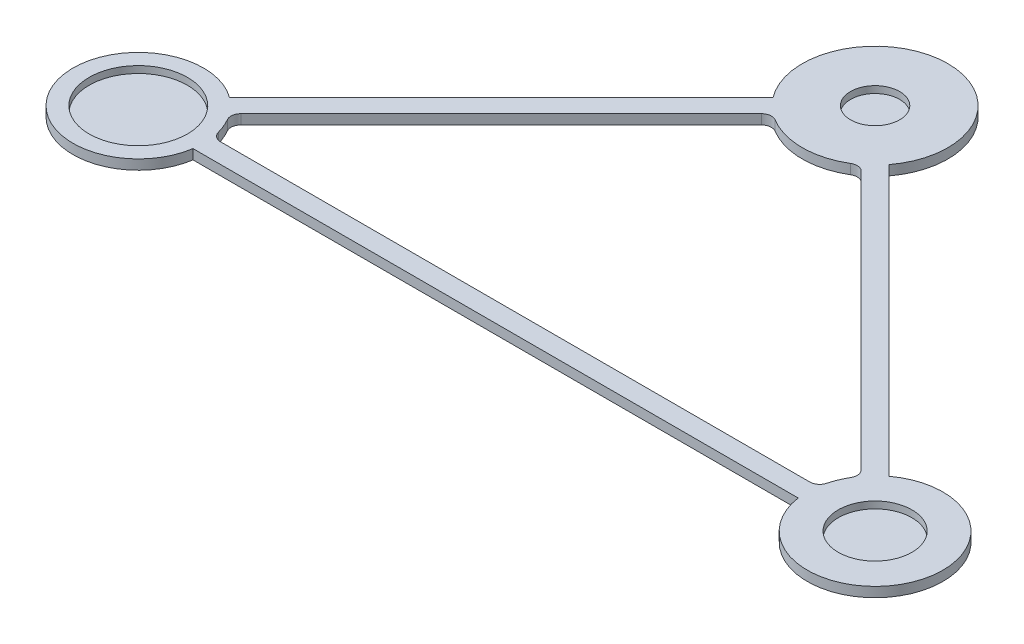
ISO-10303-21;
HEADER;
FILE_DESCRIPTION(('STEP AP214'),'2;1');
FILE_NAME('part.step','',(''),(''),'','','');
FILE_SCHEMA(('AUTOMOTIVE_DESIGN { 1 0 10303 214 1 1 1 1 }'));
ENDSEC;
DATA;
#1=APPLICATION_CONTEXT('core data for automotive mechanical design processes');
#2=APPLICATION_PROTOCOL_DEFINITION('international standard','automotive_design',2000,#1);
#3=PRODUCT_CONTEXT('',#1,'mechanical');
#4=PRODUCT('Part','Part','',(#3));
#5=PRODUCT_RELATED_PRODUCT_CATEGORY('part','',(#4));
#6=PRODUCT_DEFINITION_FORMATION('','',#4);
#7=PRODUCT_DEFINITION_CONTEXT('part definition',#1,'design');
#8=PRODUCT_DEFINITION('design','',#6,#7);
#9=PRODUCT_DEFINITION_SHAPE('','',#8);
#10=(LENGTH_UNIT() NAMED_UNIT(*) SI_UNIT(.MILLI.,.METRE.));
#11=(NAMED_UNIT(*) PLANE_ANGLE_UNIT() SI_UNIT($,.RADIAN.));
#12=(NAMED_UNIT(*) SI_UNIT($,.STERADIAN.) SOLID_ANGLE_UNIT());
#13=UNCERTAINTY_MEASURE_WITH_UNIT(LENGTH_MEASURE(1.E-05),#10,'distance_accuracy_value','');
#14=(GEOMETRIC_REPRESENTATION_CONTEXT(3) GLOBAL_UNCERTAINTY_ASSIGNED_CONTEXT((#13)) GLOBAL_UNIT_ASSIGNED_CONTEXT((#10,
#11,#12)) REPRESENTATION_CONTEXT('',''));
#15=CARTESIAN_POINT('',(0.,0.,0.));
#16=DIRECTION('',(0.,0.,1.));
#17=DIRECTION('',(1.,0.,0.));
#18=AXIS2_PLACEMENT_3D('',#15,#16,#17);
#19=CARTESIAN_POINT('',(-75.,2.,0.));
#20=DIRECTION('',(0.,1.,0.));
#21=DIRECTION('',(0.,0.,1.));
#22=AXIS2_PLACEMENT_3D('',#19,#20,#21);
#23=PLANE('',#22);
#24=CARTESIAN_POINT('',(0.,2.,-74.9999999999997));
#25=DIRECTION('',(0.,1.,0.));
#26=DIRECTION('',(0.,0.,1.));
#27=AXIS2_PLACEMENT_3D('',#24,#25,#26);
#28=CIRCLE('',#27,5.);
#29=CARTESIAN_POINT('',(0.,2.,-69.9999999999997));
#30=VERTEX_POINT('',#29);
#31=EDGE_CURVE('E651',#30,#30,#28,.T.);
#32=ORIENTED_EDGE('',*,*,#31,.F.);
#33=EDGE_LOOP('',(#32));
#34=FACE_BOUND('',#33,.T.);
#35=CARTESIAN_POINT('',(-75.,2.,0.));
#36=DIRECTION('',(0.,1.,0.));
#37=DIRECTION('',(0.,0.,1.));
#38=AXIS2_PLACEMENT_3D('',#35,#36,#37);
#39=CIRCLE('',#38,9.99999999999999);
#40=CARTESIAN_POINT('',(-75.,2.,9.99999999999999));
#41=VERTEX_POINT('',#40);
#42=EDGE_CURVE('E642',#41,#41,#39,.T.);
#43=ORIENTED_EDGE('',*,*,#42,.F.);
#44=EDGE_LOOP('',(#43));
#45=FACE_BOUND('',#44,.T.);
#46=CARTESIAN_POINT('',(75.,2.,0.));
#47=DIRECTION('',(0.,1.,0.));
#48=DIRECTION('',(0.,0.,1.));
#49=AXIS2_PLACEMENT_3D('',#46,#47,#48);
#50=CIRCLE('',#49,7.5);
#51=CARTESIAN_POINT('',(75.,2.,7.5));
#52=VERTEX_POINT('',#51);
#53=EDGE_CURVE('E643',#52,#52,#50,.T.);
#54=ORIENTED_EDGE('',*,*,#53,.F.);
#55=EDGE_LOOP('',(#54));
#56=FACE_BOUND('',#55,.T.);
#57=CARTESIAN_POINT('',(-75.,2.,0.));
#58=DIRECTION('',(0.,1.,0.));
#59=DIRECTION('',(0.,0.,1.));
#60=AXIS2_PLACEMENT_3D('',#57,#58,#59);
#61=CIRCLE('',#60,13.2892718791999);
#62=CARTESIAN_POINT('',(-67.1243064832011,2.,-10.7041206415448));
#63=VERTEX_POINT('',#62);
#64=CARTESIAN_POINT('',(-61.8620874154494,2.,2.));
#65=VERTEX_POINT('',#64);
#66=EDGE_CURVE('E179',#63,#65,#61,.T.);
#67=ORIENTED_EDGE('',*,*,#66,.T.);
#68=DIRECTION('',(1.,0.,0.));
#69=VECTOR('',#68,1.);
#70=CARTESIAN_POINT('',(-61.8620874154494,2.,2.));
#71=LINE('',#70,#69);
#72=CARTESIAN_POINT('',(61.3402793696848,2.,2.));
#73=VERTEX_POINT('',#72);
#74=EDGE_CURVE('E167',#65,#73,#71,.T.);
#75=ORIENTED_EDGE('',*,*,#74,.T.);
#76=CARTESIAN_POINT('',(75.,2.,0.));
#77=DIRECTION('',(0.,1.,0.));
#78=DIRECTION('',(0.,0.,1.));
#79=AXIS2_PLACEMENT_3D('',#76,#77,#78);
#80=CIRCLE('',#79,13.8053601075184);
#81=CARTESIAN_POINT('',(66.7553324755633,2.,-11.0730946491827));
#82=VERTEX_POINT('',#81);
#83=EDGE_CURVE('E178',#73,#82,#80,.T.);
#84=ORIENTED_EDGE('',*,*,#83,.T.);
#85=DIRECTION('',(-0.707106781186547,0.,-0.707106781186548));
#86=VECTOR('',#85,1.);
#87=CARTESIAN_POINT('',(11.803204492,2.,-66.0252226327459));
#88=LINE('',#87,#86);
#89=CARTESIAN_POINT('',(11.803204492,2.,-66.0252226327459));
#90=VERTEX_POINT('',#89);
#91=EDGE_CURVE('E324',#82,#90,#88,.T.);
#92=ORIENTED_EDGE('',*,*,#91,.T.);
#93=CARTESIAN_POINT('',(0.,2.,-74.9999999999997));
#94=DIRECTION('',(0.,1.,0.));
#95=DIRECTION('',(0.,0.,1.));
#96=AXIS2_PLACEMENT_3D('',#93,#94,#95);
#97=CIRCLE('',#96,14.8277532037643);
#98=CARTESIAN_POINT('',(-11.803204492,2.,-66.0252226327459));
#99=VERTEX_POINT('',#98);
#100=EDGE_CURVE('E327',#90,#99,#97,.T.);
#101=ORIENTED_EDGE('',*,*,#100,.T.);
#102=DIRECTION('',(-0.707106781186547,0.,0.707106781186548));
#103=VECTOR('',#102,1.);
#104=CARTESIAN_POINT('',(-11.803204492,2.,-66.0252226327459));
#105=LINE('',#104,#103);
#106=EDGE_CURVE('E183',#99,#63,#105,.T.);
#107=ORIENTED_EDGE('',*,*,#106,.T.);
#108=EDGE_LOOP('',(#67,#75,#84,#92,#101,#107));
#109=FACE_BOUND('',#108,.T.);
#110=DIRECTION('',(1.,0.,0.));
#111=VECTOR('',#110,1.);
#112=CARTESIAN_POINT('',(-61.8620874154494,2.,-2.));
#113=LINE('',#112,#111);
#114=CARTESIAN_POINT('',(-60.2432444420837,2.,-2.));
#115=VERTEX_POINT('',#114);
#116=CARTESIAN_POINT('',(59.7091724184617,2.,-2.));
#117=VERTEX_POINT('',#116);
#118=EDGE_CURVE('E630',#115,#117,#113,.T.);
#119=ORIENTED_EDGE('',*,*,#118,.F.);
#120=CARTESIAN_POINT('',(-60.2432444420837,2.,-4.));
#121=DIRECTION('',(0.,1.,0.));
#122=DIRECTION('',(0.,0.,1.));
#123=AXIS2_PLACEMENT_3D('',#120,#121,#122);
#124=CIRCLE('',#123,2.);
#125=CARTESIAN_POINT('',(-62.1735856217696,2.,-3.47675729340104));
#126=VERTEX_POINT('',#125);
#127=EDGE_CURVE('E256',#115,#126,#124,.F.);
#128=ORIENTED_EDGE('',*,*,#127,.T.);
#129=CARTESIAN_POINT('',(-75.,2.,0.));
#130=DIRECTION('',(0.,-1.,0.));
#131=DIRECTION('',(0.,0.,1.));
#132=AXIS2_PLACEMENT_3D('',#129,#130,#131);
#133=CIRCLE('',#132,13.2892718791999);
#134=CARTESIAN_POINT('',(-63.4719167561409,2.,-6.61120592645158));
#135=VERTEX_POINT('',#134);
#136=EDGE_CURVE('E286',#135,#126,#133,.T.);
#137=ORIENTED_EDGE('',*,*,#136,.F.);
#138=CARTESIAN_POINT('',(-61.7369709519388,2.,-7.60617479856854));
#139=DIRECTION('',(0.,1.,0.));
#140=DIRECTION('',(0.,0.,1.));
#141=AXIS2_PLACEMENT_3D('',#138,#139,#140);
#142=CIRCLE('',#141,2.);
#143=CARTESIAN_POINT('',(-63.1511845143119,2.,-9.02038836094164));
#144=VERTEX_POINT('',#143);
#145=EDGE_CURVE('E262',#135,#144,#142,.F.);
#146=ORIENTED_EDGE('',*,*,#145,.T.);
#147=DIRECTION('',(-0.707106781186547,0.,0.707106781186548));
#148=VECTOR('',#147,1.);
#149=CARTESIAN_POINT('',(-8.97477736725386,2.,-63.1967955079997));
#150=LINE('',#149,#148);
#151=CARTESIAN_POINT('',(-10.1437550715781,2.,-62.0278178036755));
#152=VERTEX_POINT('',#151);
#153=EDGE_CURVE('E292',#152,#144,#150,.T.);
#154=ORIENTED_EDGE('',*,*,#153,.F.);
#155=CARTESIAN_POINT('',(-8.72954150920501,2.,-60.6136042413024));
#156=DIRECTION('',(0.,1.,0.));
#157=DIRECTION('',(0.,0.,1.));
#158=AXIS2_PLACEMENT_3D('',#155,#156,#157);
#159=CIRCLE('',#158,2.);
#160=CARTESIAN_POINT('',(-7.69202433106476,2.,-62.323445785149));
#161=VERTEX_POINT('',#160);
#162=EDGE_CURVE('E12',#152,#161,#159,.F.);
#163=ORIENTED_EDGE('',*,*,#162,.T.);
#164=CARTESIAN_POINT('',(0.,2.,-74.9999999999997));
#165=DIRECTION('',(0.,-1.,0.));
#166=DIRECTION('',(0.,0.,1.));
#167=AXIS2_PLACEMENT_3D('',#164,#165,#166);
#168=CIRCLE('',#167,14.8277532037643);
#169=CARTESIAN_POINT('',(7.69202433106477,2.,-62.323445785149));
#170=VERTEX_POINT('',#169);
#171=EDGE_CURVE('E289',#170,#161,#168,.T.);
#172=ORIENTED_EDGE('',*,*,#171,.F.);
#173=CARTESIAN_POINT('',(8.72954150920501,2.,-60.6136042413024));
#174=DIRECTION('',(0.,1.,0.));
#175=DIRECTION('',(0.,0.,1.));
#176=AXIS2_PLACEMENT_3D('',#173,#174,#175);
#177=CIRCLE('',#176,2.);
#178=CARTESIAN_POINT('',(10.1437550715781,2.,-62.0278178036755));
#179=VERTEX_POINT('',#178);
#180=EDGE_CURVE('E268',#170,#179,#177,.F.);
#181=ORIENTED_EDGE('',*,*,#180,.T.);
#182=DIRECTION('',(-0.707106781186548,0.,-0.707106781186548));
#183=VECTOR('',#182,1.);
#184=CARTESIAN_POINT('',(8.97477736725386,2.,-63.1967955079997));
#185=LINE('',#184,#183);
#186=CARTESIAN_POINT('',(62.7735385647668,2.,-9.3980343104868));
#187=VERTEX_POINT('',#186);
#188=EDGE_CURVE('E293',#187,#179,#185,.T.);
#189=ORIENTED_EDGE('',*,*,#188,.F.);
#190=CARTESIAN_POINT('',(61.3593250023937,2.,-7.9838207481137));
#191=DIRECTION('',(0.,1.,0.));
#192=DIRECTION('',(0.,0.,1.));
#193=AXIS2_PLACEMENT_3D('',#190,#191,#192);
#194=CIRCLE('',#193,2.);
#195=CARTESIAN_POINT('',(63.0854071548804,2.,-6.97355325736341));
#196=VERTEX_POINT('',#195);
#197=EDGE_CURVE('E244',#187,#196,#194,.F.);
#198=ORIENTED_EDGE('',*,*,#197,.T.);
#199=CARTESIAN_POINT('',(75.,2.,0.));
#200=DIRECTION('',(0.,-1.,0.));
#201=DIRECTION('',(0.,0.,1.));
#202=AXIS2_PLACEMENT_3D('',#199,#200,#201);
#203=CIRCLE('',#202,13.8053601075184);
#204=CARTESIAN_POINT('',(61.6440638068919,2.,-3.49384259861346));
#205=VERTEX_POINT('',#204);
#206=EDGE_CURVE('E299',#205,#196,#203,.T.);
#207=ORIENTED_EDGE('',*,*,#206,.F.);
#208=CARTESIAN_POINT('',(59.7091724184617,2.,-4.));
#209=DIRECTION('',(0.,1.,0.));
#210=DIRECTION('',(0.,0.,1.));
#211=AXIS2_PLACEMENT_3D('',#208,#209,#210);
#212=CIRCLE('',#211,2.);
#213=EDGE_CURVE('E250',#205,#117,#212,.F.);
#214=ORIENTED_EDGE('',*,*,#213,.T.);
#215=EDGE_LOOP('',(#119,#128,#137,#146,#154,#163,#172,#181,#189,#198,#207,#214));
#216=FACE_BOUND('',#215,.T.);
#217=ADVANCED_FACE('F41',(#34,#45,#56,#109,#216),#23,.T.);
#218=CARTESIAN_POINT('',(-75.,0.,0.));
#219=DIRECTION('',(0.,1.,0.));
#220=DIRECTION('',(0.,0.,1.));
#221=AXIS2_PLACEMENT_3D('',#218,#219,#220);
#222=PLANE('',#221);
#223=CARTESIAN_POINT('',(-75.,0.,0.));
#224=DIRECTION('',(0.,1.,0.));
#225=DIRECTION('',(0.,0.,1.));
#226=AXIS2_PLACEMENT_3D('',#223,#224,#225);
#227=CIRCLE('',#226,13.2892718791999);
#228=CARTESIAN_POINT('',(-67.1243064832011,0.,-10.7041206415448));
#229=VERTEX_POINT('',#228);
#230=CARTESIAN_POINT('',(-61.8620874154494,0.,2.));
#231=VERTEX_POINT('',#230);
#232=EDGE_CURVE('E192',#229,#231,#227,.T.);
#233=ORIENTED_EDGE('',*,*,#232,.F.);
#234=DIRECTION('',(-0.707106781186547,0.,0.707106781186548));
#235=VECTOR('',#234,1.);
#236=CARTESIAN_POINT('',(-11.803204492,0.,-66.0252226327459));
#237=LINE('',#236,#235);
#238=CARTESIAN_POINT('',(-11.803204492,0.,-66.0252226327459));
#239=VERTEX_POINT('',#238);
#240=EDGE_CURVE('E188',#239,#229,#237,.T.);
#241=ORIENTED_EDGE('',*,*,#240,.F.);
#242=CARTESIAN_POINT('',(0.,0.,-74.9999999999997));
#243=DIRECTION('',(0.,1.,0.));
#244=DIRECTION('',(0.,0.,1.));
#245=AXIS2_PLACEMENT_3D('',#242,#243,#244);
#246=CIRCLE('',#245,14.8277532037643);
#247=CARTESIAN_POINT('',(11.803204492,0.,-66.0252226327459));
#248=VERTEX_POINT('',#247);
#249=EDGE_CURVE('E344',#248,#239,#246,.T.);
#250=ORIENTED_EDGE('',*,*,#249,.F.);
#251=DIRECTION('',(-0.707106781186547,0.,-0.707106781186548));
#252=VECTOR('',#251,1.);
#253=CARTESIAN_POINT('',(11.803204492,0.,-66.0252226327459));
#254=LINE('',#253,#252);
#255=CARTESIAN_POINT('',(66.7553324755633,0.,-11.0730946491827));
#256=VERTEX_POINT('',#255);
#257=EDGE_CURVE('E341',#256,#248,#254,.T.);
#258=ORIENTED_EDGE('',*,*,#257,.F.);
#259=CARTESIAN_POINT('',(75.,0.,0.));
#260=DIRECTION('',(0.,1.,0.));
#261=DIRECTION('',(0.,0.,1.));
#262=AXIS2_PLACEMENT_3D('',#259,#260,#261);
#263=CIRCLE('',#262,13.8053601075184);
#264=CARTESIAN_POINT('',(61.3402793696848,0.,2.));
#265=VERTEX_POINT('',#264);
#266=EDGE_CURVE('E338',#265,#256,#263,.T.);
#267=ORIENTED_EDGE('',*,*,#266,.F.);
#268=DIRECTION('',(1.,0.,0.));
#269=VECTOR('',#268,1.);
#270=CARTESIAN_POINT('',(-61.8620874154494,0.,2.));
#271=LINE('',#270,#269);
#272=EDGE_CURVE('E335',#231,#265,#271,.T.);
#273=ORIENTED_EDGE('',*,*,#272,.F.);
#274=EDGE_LOOP('',(#233,#241,#250,#258,#267,#273));
#275=FACE_BOUND('',#274,.T.);
#276=DIRECTION('',(-0.707106781186547,0.,0.707106781186548));
#277=VECTOR('',#276,1.);
#278=CARTESIAN_POINT('',(-8.97477736725386,0.,-63.1967955079997));
#279=LINE('',#278,#277);
#280=CARTESIAN_POINT('',(-10.1437550715781,0.,-62.0278178036755));
#281=VERTEX_POINT('',#280);
#282=CARTESIAN_POINT('',(-63.1511845143119,0.,-9.02038836094164));
#283=VERTEX_POINT('',#282);
#284=EDGE_CURVE('E276',#281,#283,#279,.T.);
#285=ORIENTED_EDGE('',*,*,#284,.T.);
#286=CARTESIAN_POINT('',(-61.7369709519388,0.,-7.60617479856854));
#287=DIRECTION('',(0.,1.,0.));
#288=DIRECTION('',(0.,0.,1.));
#289=AXIS2_PLACEMENT_3D('',#286,#287,#288);
#290=CIRCLE('',#289,2.);
#291=CARTESIAN_POINT('',(-63.4719167561409,0.,-6.61120592645158));
#292=VERTEX_POINT('',#291);
#293=EDGE_CURVE('E259',#283,#292,#290,.T.);
#294=ORIENTED_EDGE('',*,*,#293,.T.);
#295=CARTESIAN_POINT('',(-75.,0.,0.));
#296=DIRECTION('',(0.,-1.,0.));
#297=DIRECTION('',(0.,0.,1.));
#298=AXIS2_PLACEMENT_3D('',#295,#296,#297);
#299=CIRCLE('',#298,13.2892718791999);
#300=CARTESIAN_POINT('',(-62.1735856217696,0.,-3.47675729340104));
#301=VERTEX_POINT('',#300);
#302=EDGE_CURVE('E303',#292,#301,#299,.T.);
#303=ORIENTED_EDGE('',*,*,#302,.T.);
#304=CARTESIAN_POINT('',(-60.2432444420837,0.,-4.));
#305=DIRECTION('',(0.,1.,0.));
#306=DIRECTION('',(0.,0.,1.));
#307=AXIS2_PLACEMENT_3D('',#304,#305,#306);
#308=CIRCLE('',#307,2.);
#309=CARTESIAN_POINT('',(-60.2432444420837,0.,-2.));
#310=VERTEX_POINT('',#309);
#311=EDGE_CURVE('E253',#301,#310,#308,.T.);
#312=ORIENTED_EDGE('',*,*,#311,.T.);
#313=DIRECTION('',(1.,0.,0.));
#314=VECTOR('',#313,1.);
#315=CARTESIAN_POINT('',(-61.8620874154494,0.,-2.));
#316=LINE('',#315,#314);
#317=CARTESIAN_POINT('',(59.7091724184617,0.,-2.));
#318=VERTEX_POINT('',#317);
#319=EDGE_CURVE('E307',#310,#318,#316,.T.);
#320=ORIENTED_EDGE('',*,*,#319,.T.);
#321=CARTESIAN_POINT('',(59.7091724184617,0.,-4.));
#322=DIRECTION('',(0.,1.,0.));
#323=DIRECTION('',(0.,0.,1.));
#324=AXIS2_PLACEMENT_3D('',#321,#322,#323);
#325=CIRCLE('',#324,2.);
#326=CARTESIAN_POINT('',(61.6440638068919,0.,-3.49384259861346));
#327=VERTEX_POINT('',#326);
#328=EDGE_CURVE('E247',#318,#327,#325,.T.);
#329=ORIENTED_EDGE('',*,*,#328,.T.);
#330=CARTESIAN_POINT('',(75.,0.,0.));
#331=DIRECTION('',(0.,-1.,0.));
#332=DIRECTION('',(0.,0.,1.));
#333=AXIS2_PLACEMENT_3D('',#330,#331,#332);
#334=CIRCLE('',#333,13.8053601075184);
#335=CARTESIAN_POINT('',(63.0854071548804,0.,-6.97355325736341));
#336=VERTEX_POINT('',#335);
#337=EDGE_CURVE('E312',#327,#336,#334,.T.);
#338=ORIENTED_EDGE('',*,*,#337,.T.);
#339=CARTESIAN_POINT('',(61.3593250023937,0.,-7.9838207481137));
#340=DIRECTION('',(0.,1.,0.));
#341=DIRECTION('',(0.,0.,1.));
#342=AXIS2_PLACEMENT_3D('',#339,#340,#341);
#343=CIRCLE('',#342,2.);
#344=CARTESIAN_POINT('',(62.7735385647668,0.,-9.3980343104868));
#345=VERTEX_POINT('',#344);
#346=EDGE_CURVE('E241',#336,#345,#343,.T.);
#347=ORIENTED_EDGE('',*,*,#346,.T.);
#348=DIRECTION('',(-0.707106781186548,0.,-0.707106781186548));
#349=VECTOR('',#348,1.);
#350=CARTESIAN_POINT('',(8.97477736725386,0.,-63.1967955079997));
#351=LINE('',#350,#349);
#352=CARTESIAN_POINT('',(10.1437550715781,0.,-62.0278178036755));
#353=VERTEX_POINT('',#352);
#354=EDGE_CURVE('E316',#345,#353,#351,.T.);
#355=ORIENTED_EDGE('',*,*,#354,.T.);
#356=CARTESIAN_POINT('',(8.72954150920501,0.,-60.6136042413024));
#357=DIRECTION('',(0.,1.,0.));
#358=DIRECTION('',(0.,0.,1.));
#359=AXIS2_PLACEMENT_3D('',#356,#357,#358);
#360=CIRCLE('',#359,2.);
#361=CARTESIAN_POINT('',(7.69202433106477,0.,-62.323445785149));
#362=VERTEX_POINT('',#361);
#363=EDGE_CURVE('E265',#353,#362,#360,.T.);
#364=ORIENTED_EDGE('',*,*,#363,.T.);
#365=CARTESIAN_POINT('',(0.,0.,-74.9999999999997));
#366=DIRECTION('',(0.,-1.,0.));
#367=DIRECTION('',(0.,0.,1.));
#368=AXIS2_PLACEMENT_3D('',#365,#366,#367);
#369=CIRCLE('',#368,14.8277532037643);
#370=CARTESIAN_POINT('',(-7.69202433106476,0.,-62.323445785149));
#371=VERTEX_POINT('',#370);
#372=EDGE_CURVE('E277',#362,#371,#369,.T.);
#373=ORIENTED_EDGE('',*,*,#372,.T.);
#374=CARTESIAN_POINT('',(-8.72954150920501,0.,-60.6136042413024));
#375=DIRECTION('',(0.,1.,0.));
#376=DIRECTION('',(0.,0.,1.));
#377=AXIS2_PLACEMENT_3D('',#374,#375,#376);
#378=CIRCLE('',#377,2.);
#379=EDGE_CURVE('E50',#371,#281,#378,.T.);
#380=ORIENTED_EDGE('',*,*,#379,.T.);
#381=EDGE_LOOP('',(#285,#294,#303,#312,#320,#329,#338,#347,#355,#364,#373,#380));
#382=FACE_BOUND('',#381,.T.);
#383=ADVANCED_FACE('F275',(#275,#382),#222,.F.);
#384=CARTESIAN_POINT('',(-75.,2.,0.));
#385=DIRECTION('',(0.,-1.,0.));
#386=DIRECTION('',(0.,0.,-1.));
#387=AXIS2_PLACEMENT_3D('',#384,#385,#386);
#388=CYLINDRICAL_SURFACE('',#387,13.2892718791999);
#389=ORIENTED_EDGE('',*,*,#232,.T.);
#390=DIRECTION('',(0.,-1.,0.));
#391=VECTOR('',#390,1.);
#392=CARTESIAN_POINT('',(-61.8620874154494,2.,2.));
#393=LINE('',#392,#391);
#394=EDGE_CURVE('E171',#65,#231,#393,.T.);
#395=ORIENTED_EDGE('',*,*,#394,.F.);
#396=ORIENTED_EDGE('',*,*,#66,.F.);
#397=DIRECTION('',(0.,-1.,0.));
#398=VECTOR('',#397,1.);
#399=CARTESIAN_POINT('',(-67.1243064832011,2.,-10.7041206415448));
#400=LINE('',#399,#398);
#401=EDGE_CURVE('E332',#63,#229,#400,.T.);
#402=ORIENTED_EDGE('',*,*,#401,.T.);
#403=EDGE_LOOP('',(#389,#395,#396,#402));
#404=FACE_BOUND('',#403,.T.);
#405=ADVANCED_FACE('F190',(#404),#388,.T.);
#406=CARTESIAN_POINT('',(-61.8620874154494,2.,2.));
#407=DIRECTION('',(0.,0.,-1.));
#408=DIRECTION('',(-1.,0.,0.));
#409=AXIS2_PLACEMENT_3D('',#406,#407,#408);
#410=PLANE('',#409);
#411=ORIENTED_EDGE('',*,*,#272,.T.);
#412=DIRECTION('',(0.,-1.,0.));
#413=VECTOR('',#412,1.);
#414=CARTESIAN_POINT('',(61.3402793696848,2.,2.));
#415=LINE('',#414,#413);
#416=EDGE_CURVE('E174',#73,#265,#415,.T.);
#417=ORIENTED_EDGE('',*,*,#416,.F.);
#418=ORIENTED_EDGE('',*,*,#74,.F.);
#419=ORIENTED_EDGE('',*,*,#394,.T.);
#420=EDGE_LOOP('',(#411,#417,#418,#419));
#421=FACE_BOUND('',#420,.T.);
#422=ADVANCED_FACE('F169',(#421),#410,.F.);
#423=CARTESIAN_POINT('',(75.,2.,0.));
#424=DIRECTION('',(0.,-1.,0.));
#425=DIRECTION('',(0.,0.,-1.));
#426=AXIS2_PLACEMENT_3D('',#423,#424,#425);
#427=CYLINDRICAL_SURFACE('',#426,13.8053601075184);
#428=ORIENTED_EDGE('',*,*,#266,.T.);
#429=DIRECTION('',(0.,-1.,0.));
#430=VECTOR('',#429,1.);
#431=CARTESIAN_POINT('',(66.7553324755633,2.,-11.0730946491827));
#432=LINE('',#431,#430);
#433=EDGE_CURVE('E200',#82,#256,#432,.T.);
#434=ORIENTED_EDGE('',*,*,#433,.F.);
#435=ORIENTED_EDGE('',*,*,#83,.F.);
#436=ORIENTED_EDGE('',*,*,#416,.T.);
#437=EDGE_LOOP('',(#428,#434,#435,#436));
#438=FACE_BOUND('',#437,.T.);
#439=ADVANCED_FACE('F377',(#438),#427,.T.);
#440=CARTESIAN_POINT('',(11.803204492,2.,-66.0252226327459));
#441=DIRECTION('',(-0.707106781186548,0.,0.707106781186547));
#442=DIRECTION('',(0.707106781186547,0.,0.707106781186548));
#443=AXIS2_PLACEMENT_3D('',#440,#441,#442);
#444=PLANE('',#443);
#445=ORIENTED_EDGE('',*,*,#257,.T.);
#446=DIRECTION('',(0.,-1.,0.));
#447=VECTOR('',#446,1.);
#448=CARTESIAN_POINT('',(11.803204492,2.,-66.0252226327459));
#449=LINE('',#448,#447);
#450=EDGE_CURVE('E355',#90,#248,#449,.T.);
#451=ORIENTED_EDGE('',*,*,#450,.F.);
#452=ORIENTED_EDGE('',*,*,#91,.F.);
#453=ORIENTED_EDGE('',*,*,#433,.T.);
#454=EDGE_LOOP('',(#445,#451,#452,#453));
#455=FACE_BOUND('',#454,.T.);
#456=ADVANCED_FACE('F364',(#455),#444,.F.);
#457=CARTESIAN_POINT('',(0.,2.,-74.9999999999997));
#458=DIRECTION('',(0.,-1.,0.));
#459=DIRECTION('',(0.,0.,-1.));
#460=AXIS2_PLACEMENT_3D('',#457,#458,#459);
#461=CYLINDRICAL_SURFACE('',#460,14.8277532037643);
#462=ORIENTED_EDGE('',*,*,#249,.T.);
#463=DIRECTION('',(0.,-1.,0.));
#464=VECTOR('',#463,1.);
#465=CARTESIAN_POINT('',(-11.803204492,2.,-66.0252226327459));
#466=LINE('',#465,#464);
#467=EDGE_CURVE('E351',#99,#239,#466,.T.);
#468=ORIENTED_EDGE('',*,*,#467,.F.);
#469=ORIENTED_EDGE('',*,*,#100,.F.);
#470=ORIENTED_EDGE('',*,*,#450,.T.);
#471=EDGE_LOOP('',(#462,#468,#469,#470));
#472=FACE_BOUND('',#471,.T.);
#473=ADVANCED_FACE('F373',(#472),#461,.T.);
#474=CARTESIAN_POINT('',(-11.803204492,2.,-66.0252226327459));
#475=DIRECTION('',(0.707106781186548,0.,0.707106781186547));
#476=DIRECTION('',(0.707106781186547,0.,-0.707106781186548));
#477=AXIS2_PLACEMENT_3D('',#474,#475,#476);
#478=PLANE('',#477);
#479=ORIENTED_EDGE('',*,*,#240,.T.);
#480=ORIENTED_EDGE('',*,*,#401,.F.);
#481=ORIENTED_EDGE('',*,*,#106,.F.);
#482=ORIENTED_EDGE('',*,*,#467,.T.);
#483=EDGE_LOOP('',(#479,#480,#481,#482));
#484=FACE_BOUND('',#483,.T.);
#485=ADVANCED_FACE('F376',(#484),#478,.F.);
#486=CARTESIAN_POINT('',(-75.,2.,0.));
#487=DIRECTION('',(0.,-1.,0.));
#488=DIRECTION('',(0.,0.,-1.));
#489=AXIS2_PLACEMENT_3D('',#486,#487,#488);
#490=CYLINDRICAL_SURFACE('',#489,13.2892718791999);
#491=ORIENTED_EDGE('',*,*,#136,.T.);
#492=DIRECTION('',(0.,-1.,0.));
#493=VECTOR('',#492,1.);
#494=CARTESIAN_POINT('',(-62.1735856217696,2.,-3.47675729340104));
#495=LINE('',#494,#493);
#496=EDGE_CURVE('E224',#126,#301,#495,.T.);
#497=ORIENTED_EDGE('',*,*,#496,.T.);
#498=ORIENTED_EDGE('',*,*,#302,.F.);
#499=DIRECTION('',(0.,-1.,0.));
#500=VECTOR('',#499,1.);
#501=CARTESIAN_POINT('',(-63.4719167561409,2.,-6.61120592645158));
#502=LINE('',#501,#500);
#503=EDGE_CURVE('E221',#292,#135,#502,.F.);
#504=ORIENTED_EDGE('',*,*,#503,.T.);
#505=EDGE_LOOP('',(#491,#497,#498,#504));
#506=FACE_BOUND('',#505,.T.);
#507=ADVANCED_FACE('F396',(#506),#490,.T.);
#508=CARTESIAN_POINT('',(-61.8620874154494,2.,-2.));
#509=DIRECTION('',(0.,0.,-1.));
#510=DIRECTION('',(-1.,0.,0.));
#511=AXIS2_PLACEMENT_3D('',#508,#509,#510);
#512=PLANE('',#511);
#513=ORIENTED_EDGE('',*,*,#118,.T.);
#514=DIRECTION('',(0.,1.,0.));
#515=VECTOR('',#514,1.);
#516=CARTESIAN_POINT('',(59.7091724184617,0.,-2.));
#517=LINE('',#516,#515);
#518=EDGE_CURVE('E217',#117,#318,#517,.F.);
#519=ORIENTED_EDGE('',*,*,#518,.T.);
#520=ORIENTED_EDGE('',*,*,#319,.F.);
#521=DIRECTION('',(0.,1.,0.));
#522=VECTOR('',#521,1.);
#523=CARTESIAN_POINT('',(-60.2432444420837,2.,-2.));
#524=LINE('',#523,#522);
#525=EDGE_CURVE('E214',#310,#115,#524,.T.);
#526=ORIENTED_EDGE('',*,*,#525,.T.);
#527=EDGE_LOOP('',(#513,#519,#520,#526));
#528=FACE_BOUND('',#527,.T.);
#529=ADVANCED_FACE('F417',(#528),#512,.T.);
#530=CARTESIAN_POINT('',(75.,2.,0.));
#531=DIRECTION('',(0.,-1.,0.));
#532=DIRECTION('',(0.,0.,-1.));
#533=AXIS2_PLACEMENT_3D('',#530,#531,#532);
#534=CYLINDRICAL_SURFACE('',#533,13.8053601075184);
#535=ORIENTED_EDGE('',*,*,#206,.T.);
#536=DIRECTION('',(0.,-1.,0.));
#537=VECTOR('',#536,1.);
#538=CARTESIAN_POINT('',(63.0854071548804,2.,-6.97355325736341));
#539=LINE('',#538,#537);
#540=EDGE_CURVE('E198',#196,#336,#539,.T.);
#541=ORIENTED_EDGE('',*,*,#540,.T.);
#542=ORIENTED_EDGE('',*,*,#337,.F.);
#543=DIRECTION('',(0.,-1.,0.));
#544=VECTOR('',#543,1.);
#545=CARTESIAN_POINT('',(61.6440638068919,2.,-3.49384259861346));
#546=LINE('',#545,#544);
#547=EDGE_CURVE('E194',#327,#205,#546,.F.);
#548=ORIENTED_EDGE('',*,*,#547,.T.);
#549=EDGE_LOOP('',(#535,#541,#542,#548));
#550=FACE_BOUND('',#549,.T.);
#551=ADVANCED_FACE('F425',(#550),#534,.T.);
#552=CARTESIAN_POINT('',(8.97477736725386,2.,-63.1967955079997));
#553=DIRECTION('',(-0.707106781186547,0.,0.707106781186547));
#554=DIRECTION('',(0.707106781186548,0.,0.707106781186548));
#555=AXIS2_PLACEMENT_3D('',#552,#553,#554);
#556=PLANE('',#555);
#557=ORIENTED_EDGE('',*,*,#354,.F.);
#558=DIRECTION('',(0.,1.,0.));
#559=VECTOR('',#558,1.);
#560=CARTESIAN_POINT('',(62.7735385647668,2.,-9.3980343104868));
#561=LINE('',#560,#559);
#562=EDGE_CURVE('E211',#345,#187,#561,.T.);
#563=ORIENTED_EDGE('',*,*,#562,.T.);
#564=ORIENTED_EDGE('',*,*,#188,.T.);
#565=DIRECTION('',(0.,1.,0.));
#566=VECTOR('',#565,1.);
#567=CARTESIAN_POINT('',(10.1437550715781,0.,-62.0278178036755));
#568=LINE('',#567,#566);
#569=EDGE_CURVE('E207',#179,#353,#568,.F.);
#570=ORIENTED_EDGE('',*,*,#569,.T.);
#571=EDGE_LOOP('',(#557,#563,#564,#570));
#572=FACE_BOUND('',#571,.T.);
#573=ADVANCED_FACE('F432',(#572),#556,.T.);
#574=CARTESIAN_POINT('',(0.,2.,-74.9999999999997));
#575=DIRECTION('',(0.,-1.,0.));
#576=DIRECTION('',(0.,0.,-1.));
#577=AXIS2_PLACEMENT_3D('',#574,#575,#576);
#578=CYLINDRICAL_SURFACE('',#577,14.8277532037643);
#579=ORIENTED_EDGE('',*,*,#372,.F.);
#580=DIRECTION('',(0.,-1.,0.));
#581=VECTOR('',#580,1.);
#582=CARTESIAN_POINT('',(7.69202433106477,2.,-62.323445785149));
#583=LINE('',#582,#581);
#584=EDGE_CURVE('E62',#362,#170,#583,.F.);
#585=ORIENTED_EDGE('',*,*,#584,.T.);
#586=ORIENTED_EDGE('',*,*,#171,.T.);
#587=DIRECTION('',(0.,-1.,0.));
#588=VECTOR('',#587,1.);
#589=CARTESIAN_POINT('',(-7.69202433106476,2.,-62.323445785149));
#590=LINE('',#589,#588);
#591=EDGE_CURVE('E235',#161,#371,#590,.T.);
#592=ORIENTED_EDGE('',*,*,#591,.T.);
#593=EDGE_LOOP('',(#579,#585,#586,#592));
#594=FACE_BOUND('',#593,.T.);
#595=ADVANCED_FACE('F288',(#594),#578,.T.);
#596=CARTESIAN_POINT('',(-8.97477736725386,2.,-63.1967955079997));
#597=DIRECTION('',(0.707106781186548,0.,0.707106781186547));
#598=DIRECTION('',(0.707106781186547,0.,-0.707106781186548));
#599=AXIS2_PLACEMENT_3D('',#596,#597,#598);
#600=PLANE('',#599);
#601=ORIENTED_EDGE('',*,*,#153,.T.);
#602=DIRECTION('',(0.,1.,0.));
#603=VECTOR('',#602,1.);
#604=CARTESIAN_POINT('',(-63.1511845143119,0.,-9.02038836094164));
#605=LINE('',#604,#603);
#606=EDGE_CURVE('E231',#144,#283,#605,.F.);
#607=ORIENTED_EDGE('',*,*,#606,.T.);
#608=ORIENTED_EDGE('',*,*,#284,.F.);
#609=DIRECTION('',(0.,1.,0.));
#610=VECTOR('',#609,1.);
#611=CARTESIAN_POINT('',(-10.1437550715781,2.,-62.0278178036755));
#612=LINE('',#611,#610);
#613=EDGE_CURVE('E228',#281,#152,#612,.T.);
#614=ORIENTED_EDGE('',*,*,#613,.T.);
#615=EDGE_LOOP('',(#601,#607,#608,#614));
#616=FACE_BOUND('',#615,.T.);
#617=ADVANCED_FACE('F283',(#616),#600,.T.);
#618=CARTESIAN_POINT('',(75.,-28.2842712474619,0.));
#619=DIRECTION('',(0.,1.,0.));
#620=DIRECTION('',(0.,0.,1.));
#621=AXIS2_PLACEMENT_3D('',#618,#619,#620);
#622=CYLINDRICAL_SURFACE('',#621,7.5);
#623=CARTESIAN_POINT('',(75.,0.6,0.));
#624=DIRECTION('',(0.,1.,0.));
#625=DIRECTION('',(0.,0.,1.));
#626=AXIS2_PLACEMENT_3D('',#623,#624,#625);
#627=CIRCLE('',#626,7.5);
#628=CARTESIAN_POINT('',(75.,0.6,7.5));
#629=VERTEX_POINT('',#628);
#630=EDGE_CURVE('E638',#629,#629,#627,.F.);
#631=ORIENTED_EDGE('',*,*,#630,.T.);
#632=EDGE_LOOP('',(#631));
#633=FACE_BOUND('',#632,.T.);
#634=ORIENTED_EDGE('',*,*,#53,.T.);
#635=EDGE_LOOP('',(#634));
#636=FACE_BOUND('',#635,.T.);
#637=ADVANCED_FACE('F453',(#633,#636),#622,.F.);
#638=CARTESIAN_POINT('',(-75.,0.6,0.));
#639=DIRECTION('',(0.,1.,0.));
#640=DIRECTION('',(0.,0.,1.));
#641=AXIS2_PLACEMENT_3D('',#638,#639,#640);
#642=PLANE('',#641);
#643=ORIENTED_EDGE('',*,*,#630,.F.);
#644=EDGE_LOOP('',(#643));
#645=FACE_BOUND('',#644,.T.);
#646=ADVANCED_FACE('F460',(#645),#642,.T.);
#647=CARTESIAN_POINT('',(-75.,-28.2842712474619,0.));
#648=DIRECTION('',(0.,1.,0.));
#649=DIRECTION('',(0.,0.,1.));
#650=AXIS2_PLACEMENT_3D('',#647,#648,#649);
#651=CYLINDRICAL_SURFACE('',#650,9.99999999999999);
#652=CARTESIAN_POINT('',(-75.,0.6,0.));
#653=DIRECTION('',(0.,1.,0.));
#654=DIRECTION('',(0.,0.,1.));
#655=AXIS2_PLACEMENT_3D('',#652,#653,#654);
#656=CIRCLE('',#655,9.99999999999999);
#657=CARTESIAN_POINT('',(-75.,0.6,9.99999999999999));
#658=VERTEX_POINT('',#657);
#659=EDGE_CURVE('E647',#658,#658,#656,.F.);
#660=ORIENTED_EDGE('',*,*,#659,.T.);
#661=EDGE_LOOP('',(#660));
#662=FACE_BOUND('',#661,.T.);
#663=ORIENTED_EDGE('',*,*,#42,.T.);
#664=EDGE_LOOP('',(#663));
#665=FACE_BOUND('',#664,.T.);
#666=ADVANCED_FACE('F468',(#662,#665),#651,.F.);
#667=CARTESIAN_POINT('',(-75.,0.6,0.));
#668=DIRECTION('',(0.,1.,0.));
#669=DIRECTION('',(0.,0.,1.));
#670=AXIS2_PLACEMENT_3D('',#667,#668,#669);
#671=PLANE('',#670);
#672=ORIENTED_EDGE('',*,*,#659,.F.);
#673=EDGE_LOOP('',(#672));
#674=FACE_BOUND('',#673,.T.);
#675=ADVANCED_FACE('F476',(#674),#671,.T.);
#676=CARTESIAN_POINT('',(0.,-28.2842712474619,-74.9999999999997));
#677=DIRECTION('',(0.,1.,0.));
#678=DIRECTION('',(0.,0.,1.));
#679=AXIS2_PLACEMENT_3D('',#676,#677,#678);
#680=CYLINDRICAL_SURFACE('',#679,5.);
#681=CARTESIAN_POINT('',(0.,0.6,-74.9999999999997));
#682=DIRECTION('',(0.,1.,0.));
#683=DIRECTION('',(0.,0.,1.));
#684=AXIS2_PLACEMENT_3D('',#681,#682,#683);
#685=CIRCLE('',#684,5.);
#686=CARTESIAN_POINT('',(0.,0.6,-69.9999999999997));
#687=VERTEX_POINT('',#686);
#688=EDGE_CURVE('E308',#687,#687,#685,.F.);
#689=ORIENTED_EDGE('',*,*,#688,.T.);
#690=EDGE_LOOP('',(#689));
#691=FACE_BOUND('',#690,.T.);
#692=ORIENTED_EDGE('',*,*,#31,.T.);
#693=EDGE_LOOP('',(#692));
#694=FACE_BOUND('',#693,.T.);
#695=ADVANCED_FACE('F484',(#691,#694),#680,.F.);
#696=CARTESIAN_POINT('',(-75.,0.6,0.));
#697=DIRECTION('',(0.,1.,0.));
#698=DIRECTION('',(0.,0.,1.));
#699=AXIS2_PLACEMENT_3D('',#696,#697,#698);
#700=PLANE('',#699);
#701=ORIENTED_EDGE('',*,*,#688,.F.);
#702=EDGE_LOOP('',(#701));
#703=FACE_BOUND('',#702,.T.);
#704=ADVANCED_FACE('F492',(#703),#700,.T.);
#705=CARTESIAN_POINT('',(61.3593250023937,2.,-7.9838207481137));
#706=DIRECTION('',(0.,-1.,0.));
#707=DIRECTION('',(0.,0.,-1.));
#708=AXIS2_PLACEMENT_3D('',#705,#706,#707);
#709=CYLINDRICAL_SURFACE('',#708,2.);
#710=ORIENTED_EDGE('',*,*,#197,.F.);
#711=ORIENTED_EDGE('',*,*,#562,.F.);
#712=ORIENTED_EDGE('',*,*,#346,.F.);
#713=ORIENTED_EDGE('',*,*,#540,.F.);
#714=EDGE_LOOP('',(#710,#711,#712,#713));
#715=FACE_BOUND('',#714,.T.);
#716=ADVANCED_FACE('F500',(#715),#709,.F.);
#717=CARTESIAN_POINT('',(59.7091724184617,2.,-4.));
#718=DIRECTION('',(0.,-1.,0.));
#719=DIRECTION('',(0.,0.,-1.));
#720=AXIS2_PLACEMENT_3D('',#717,#718,#719);
#721=CYLINDRICAL_SURFACE('',#720,2.);
#722=ORIENTED_EDGE('',*,*,#213,.F.);
#723=ORIENTED_EDGE('',*,*,#547,.F.);
#724=ORIENTED_EDGE('',*,*,#328,.F.);
#725=ORIENTED_EDGE('',*,*,#518,.F.);
#726=EDGE_LOOP('',(#722,#723,#724,#725));
#727=FACE_BOUND('',#726,.T.);
#728=ADVANCED_FACE('F507',(#727),#721,.F.);
#729=CARTESIAN_POINT('',(-60.2432444420837,2.,-4.));
#730=DIRECTION('',(0.,-1.,0.));
#731=DIRECTION('',(0.,0.,-1.));
#732=AXIS2_PLACEMENT_3D('',#729,#730,#731);
#733=CYLINDRICAL_SURFACE('',#732,2.);
#734=ORIENTED_EDGE('',*,*,#127,.F.);
#735=ORIENTED_EDGE('',*,*,#525,.F.);
#736=ORIENTED_EDGE('',*,*,#311,.F.);
#737=ORIENTED_EDGE('',*,*,#496,.F.);
#738=EDGE_LOOP('',(#734,#735,#736,#737));
#739=FACE_BOUND('',#738,.T.);
#740=ADVANCED_FACE('F515',(#739),#733,.F.);
#741=CARTESIAN_POINT('',(-61.7369709519388,2.,-7.60617479856854));
#742=DIRECTION('',(0.,-1.,0.));
#743=DIRECTION('',(0.,0.,-1.));
#744=AXIS2_PLACEMENT_3D('',#741,#742,#743);
#745=CYLINDRICAL_SURFACE('',#744,2.);
#746=ORIENTED_EDGE('',*,*,#145,.F.);
#747=ORIENTED_EDGE('',*,*,#503,.F.);
#748=ORIENTED_EDGE('',*,*,#293,.F.);
#749=ORIENTED_EDGE('',*,*,#606,.F.);
#750=EDGE_LOOP('',(#746,#747,#748,#749));
#751=FACE_BOUND('',#750,.T.);
#752=ADVANCED_FACE('F523',(#751),#745,.F.);
#753=CARTESIAN_POINT('',(8.72954150920501,2.,-60.6136042413024));
#754=DIRECTION('',(0.,-1.,0.));
#755=DIRECTION('',(0.,0.,-1.));
#756=AXIS2_PLACEMENT_3D('',#753,#754,#755);
#757=CYLINDRICAL_SURFACE('',#756,2.);
#758=ORIENTED_EDGE('',*,*,#180,.F.);
#759=ORIENTED_EDGE('',*,*,#584,.F.);
#760=ORIENTED_EDGE('',*,*,#363,.F.);
#761=ORIENTED_EDGE('',*,*,#569,.F.);
#762=EDGE_LOOP('',(#758,#759,#760,#761));
#763=FACE_BOUND('',#762,.T.);
#764=ADVANCED_FACE('F531',(#763),#757,.F.);
#765=CARTESIAN_POINT('',(-8.72954150920501,2.,-60.6136042413024));
#766=DIRECTION('',(0.,-1.,0.));
#767=DIRECTION('',(0.,0.,-1.));
#768=AXIS2_PLACEMENT_3D('',#765,#766,#767);
#769=CYLINDRICAL_SURFACE('',#768,2.);
#770=ORIENTED_EDGE('',*,*,#162,.F.);
#771=ORIENTED_EDGE('',*,*,#613,.F.);
#772=ORIENTED_EDGE('',*,*,#379,.F.);
#773=ORIENTED_EDGE('',*,*,#591,.F.);
#774=EDGE_LOOP('',(#770,#771,#772,#773));
#775=FACE_BOUND('',#774,.T.);
#776=ADVANCED_FACE('F43',(#775),#769,.F.);
#777=CLOSED_SHELL('',(#217,#383,#405,#422,#439,#456,#473,#485,#507,#529,#551,#573,#595,#617,
#637,#646,#666,#675,#695,#704,#716,#728,#740,#752,#764,#776));
#778=MANIFOLD_SOLID_BREP('B2',#777);
#779=ADVANCED_BREP_SHAPE_REPRESENTATION('',(#18,#778),#14);
#780=SHAPE_DEFINITION_REPRESENTATION(#9,#779);
ENDSEC;
END-ISO-10303-21;
